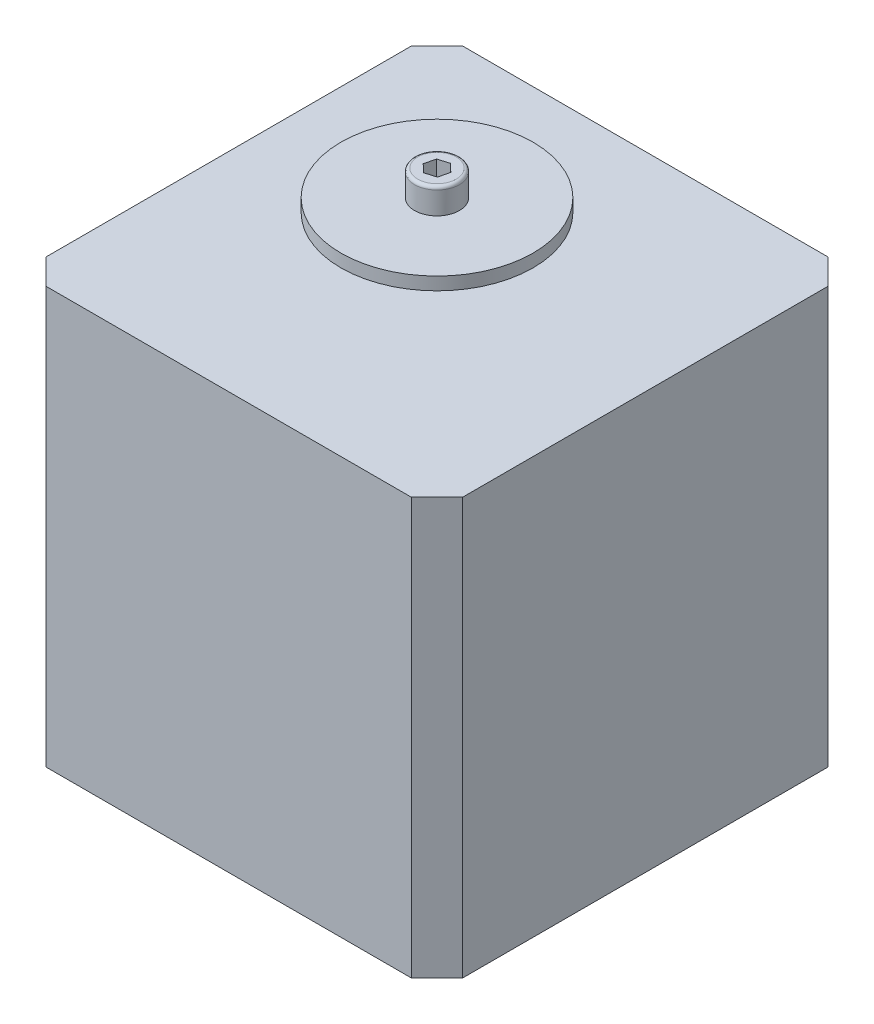
ISO-10303-21;
HEADER;
FILE_DESCRIPTION(('STEP AP214'),'2;1');
FILE_NAME('part.step','',(''),(''),'','','');
FILE_SCHEMA(('AUTOMOTIVE_DESIGN { 1 0 10303 214 1 1 1 1 }'));
ENDSEC;
DATA;
#1=APPLICATION_CONTEXT('core data for automotive mechanical design processes');
#2=APPLICATION_PROTOCOL_DEFINITION('international standard','automotive_design',2000,#1);
#3=PRODUCT_CONTEXT('',#1,'mechanical');
#4=PRODUCT('Part','Part','',(#3));
#5=PRODUCT_RELATED_PRODUCT_CATEGORY('part','',(#4));
#6=PRODUCT_DEFINITION_FORMATION('','',#4);
#7=PRODUCT_DEFINITION_CONTEXT('part definition',#1,'design');
#8=PRODUCT_DEFINITION('design','',#6,#7);
#9=PRODUCT_DEFINITION_SHAPE('','',#8);
#10=(LENGTH_UNIT() NAMED_UNIT(*) SI_UNIT(.MILLI.,.METRE.));
#11=(NAMED_UNIT(*) PLANE_ANGLE_UNIT() SI_UNIT($,.RADIAN.));
#12=(NAMED_UNIT(*) SI_UNIT($,.STERADIAN.) SOLID_ANGLE_UNIT());
#13=UNCERTAINTY_MEASURE_WITH_UNIT(LENGTH_MEASURE(1.E-05),#10,'distance_accuracy_value','');
#14=(GEOMETRIC_REPRESENTATION_CONTEXT(3) GLOBAL_UNCERTAINTY_ASSIGNED_CONTEXT((#13)) GLOBAL_UNIT_ASSIGNED_CONTEXT((#10,
#11,#12)) REPRESENTATION_CONTEXT('',''));
#15=CARTESIAN_POINT('',(0.,0.,0.));
#16=DIRECTION('',(0.,0.,1.));
#17=DIRECTION('',(1.,0.,0.));
#18=AXIS2_PLACEMENT_3D('',#15,#16,#17);
#19=CARTESIAN_POINT('',(3.,65.,0.));
#20=DIRECTION('',(0.,-1.,0.));
#21=DIRECTION('',(0.,0.,-1.));
#22=AXIS2_PLACEMENT_3D('',#19,#20,#21);
#23=PLANE('',#22);
#24=CARTESIAN_POINT('',(0.,65.,0.));
#25=DIRECTION('',(0.,-1.,0.));
#26=DIRECTION('',(0.,0.,-1.));
#27=AXIS2_PLACEMENT_3D('',#24,#25,#26);
#28=CIRCLE('',#27,3.);
#29=CARTESIAN_POINT('',(0.,65.,-3.));
#30=VERTEX_POINT('',#29);
#31=EDGE_CURVE('E147',#30,#30,#28,.T.);
#32=ORIENTED_EDGE('',*,*,#31,.T.);
#33=EDGE_LOOP('',(#32));
#34=FACE_BOUND('',#33,.T.);
#35=ADVANCED_FACE('F45',(#34),#23,.T.);
#36=CARTESIAN_POINT('',(3.5,79.,0.));
#37=DIRECTION('',(0.,1.,0.));
#38=DIRECTION('',(0.,0.,1.));
#39=AXIS2_PLACEMENT_3D('',#36,#37,#38);
#40=PLANE('',#39);
#41=CARTESIAN_POINT('',(0.,79.,0.));
#42=DIRECTION('',(0.,1.,0.));
#43=DIRECTION('',(0.,0.,1.));
#44=AXIS2_PLACEMENT_3D('',#41,#42,#43);
#45=CIRCLE('',#44,3.);
#46=CARTESIAN_POINT('',(0.,79.,3.));
#47=VERTEX_POINT('',#46);
#48=EDGE_CURVE('E12',#47,#47,#45,.T.);
#49=ORIENTED_EDGE('',*,*,#48,.T.);
#50=EDGE_LOOP('',(#49));
#51=FACE_BOUND('',#50,.T.);
#52=DIRECTION('',(0.957463301350185,0.,-0.288555066785534));
#53=VECTOR('',#52,1.);
#54=CARTESIAN_POINT('',(-0.396354941982275,79.,1.68609097025227));
#55=LINE('',#54,#53);
#56=CARTESIAN_POINT('',(-0.396354941982275,79.,1.68609097025227));
#57=VERTEX_POINT('',#56);
#58=CARTESIAN_POINT('',(1.26202014233888,79.,1.18629893379829));
#59=VERTEX_POINT('',#58);
#60=EDGE_CURVE('E60',#57,#59,#55,.T.);
#61=ORIENTED_EDGE('',*,*,#60,.F.);
#62=DIRECTION('',(0.72862766890208,0.,0.684910008767809));
#63=VECTOR('',#62,1.);
#64=CARTESIAN_POINT('',(-1.65837508432115,79.,0.499792036453975));
#65=LINE('',#64,#63);
#66=CARTESIAN_POINT('',(-1.65837508432115,79.,0.499792036453975));
#67=VERTEX_POINT('',#66);
#68=EDGE_CURVE('E143',#67,#57,#65,.T.);
#69=ORIENTED_EDGE('',*,*,#68,.F.);
#70=DIRECTION('',(-0.228835632448105,0.,0.973465075553343));
#71=VECTOR('',#70,1.);
#72=CARTESIAN_POINT('',(-1.26202014233888,79.,-1.18629893379829));
#73=LINE('',#72,#71);
#74=CARTESIAN_POINT('',(-1.26202014233888,79.,-1.18629893379829));
#75=VERTEX_POINT('',#74);
#76=EDGE_CURVE('E141',#75,#67,#73,.T.);
#77=ORIENTED_EDGE('',*,*,#76,.F.);
#78=DIRECTION('',(-0.957463301350186,0.,0.288555066785534));
#79=VECTOR('',#78,1.);
#80=CARTESIAN_POINT('',(0.396354941982275,79.,-1.68609097025227));
#81=LINE('',#80,#79);
#82=CARTESIAN_POINT('',(0.396354941982275,79.,-1.68609097025227));
#83=VERTEX_POINT('',#82);
#84=EDGE_CURVE('E108',#83,#75,#81,.T.);
#85=ORIENTED_EDGE('',*,*,#84,.F.);
#86=DIRECTION('',(-0.72862766890208,0.,-0.684910008767809));
#87=VECTOR('',#86,1.);
#88=CARTESIAN_POINT('',(1.65837508432115,79.,-0.499792036453975));
#89=LINE('',#88,#87);
#90=CARTESIAN_POINT('',(1.65837508432115,79.,-0.499792036453975));
#91=VERTEX_POINT('',#90);
#92=EDGE_CURVE('E137',#91,#83,#89,.T.);
#93=ORIENTED_EDGE('',*,*,#92,.F.);
#94=DIRECTION('',(0.228835632448105,0.,-0.973465075553343));
#95=VECTOR('',#94,1.);
#96=CARTESIAN_POINT('',(1.26202014233888,79.,1.18629893379829));
#97=LINE('',#96,#95);
#98=EDGE_CURVE('E134',#59,#91,#97,.T.);
#99=ORIENTED_EDGE('',*,*,#98,.F.);
#100=EDGE_LOOP('',(#61,#69,#77,#85,#93,#99));
#101=FACE_BOUND('',#100,.T.);
#102=ADVANCED_FACE('F181',(#51,#101),#40,.T.);
#103=CARTESIAN_POINT('',(0.,79.,0.));
#104=DIRECTION('',(0.,-1.,0.));
#105=DIRECTION('',(0.,0.,-1.));
#106=AXIS2_PLACEMENT_3D('',#103,#104,#105);
#107=CYLINDRICAL_SURFACE('',#106,3.5);
#108=CARTESIAN_POINT('',(0.,78.5,0.));
#109=DIRECTION('',(0.,1.,0.));
#110=DIRECTION('',(0.,0.,1.));
#111=AXIS2_PLACEMENT_3D('',#108,#109,#110);
#112=CIRCLE('',#111,3.5);
#113=CARTESIAN_POINT('',(0.,78.5,3.5));
#114=VERTEX_POINT('',#113);
#115=EDGE_CURVE('E53',#114,#114,#112,.F.);
#116=ORIENTED_EDGE('',*,*,#115,.T.);
#117=EDGE_LOOP('',(#116));
#118=FACE_BOUND('',#117,.T.);
#119=CARTESIAN_POINT('',(0.,75.,0.));
#120=DIRECTION('',(0.,-1.,0.));
#121=DIRECTION('',(0.,0.,-1.));
#122=AXIS2_PLACEMENT_3D('',#119,#120,#121);
#123=CIRCLE('',#122,3.5);
#124=CARTESIAN_POINT('',(0.,75.,-3.5));
#125=VERTEX_POINT('',#124);
#126=EDGE_CURVE('E164',#125,#125,#123,.T.);
#127=ORIENTED_EDGE('',*,*,#126,.F.);
#128=EDGE_LOOP('',(#127));
#129=FACE_BOUND('',#128,.T.);
#130=ADVANCED_FACE('F169',(#118,#129),#107,.T.);
#131=CARTESIAN_POINT('',(3.5,75.,0.));
#132=DIRECTION('',(0.,1.,0.));
#133=DIRECTION('',(0.,0.,1.));
#134=AXIS2_PLACEMENT_3D('',#131,#132,#133);
#135=PLANE('',#134);
#136=ORIENTED_EDGE('',*,*,#126,.T.);
#137=EDGE_LOOP('',(#136));
#138=FACE_BOUND('',#137,.T.);
#139=CARTESIAN_POINT('',(0.,75.,0.));
#140=DIRECTION('',(0.,-1.,0.));
#141=DIRECTION('',(0.,0.,-1.));
#142=AXIS2_PLACEMENT_3D('',#139,#140,#141);
#143=CIRCLE('',#142,15.);
#144=CARTESIAN_POINT('',(0.,75.,-15.));
#145=VERTEX_POINT('',#144);
#146=EDGE_CURVE('E161',#145,#145,#143,.T.);
#147=ORIENTED_EDGE('',*,*,#146,.F.);
#148=EDGE_LOOP('',(#147));
#149=FACE_BOUND('',#148,.T.);
#150=ADVANCED_FACE('F191',(#138,#149),#135,.T.);
#151=CARTESIAN_POINT('',(0.,79.,0.));
#152=DIRECTION('',(0.,-1.,0.));
#153=DIRECTION('',(0.,0.,-1.));
#154=AXIS2_PLACEMENT_3D('',#151,#152,#153);
#155=CYLINDRICAL_SURFACE('',#154,15.);
#156=ORIENTED_EDGE('',*,*,#146,.T.);
#157=EDGE_LOOP('',(#156));
#158=FACE_BOUND('',#157,.T.);
#159=CARTESIAN_POINT('',(0.,73.,0.));
#160=DIRECTION('',(0.,-1.,0.));
#161=DIRECTION('',(0.,0.,-1.));
#162=AXIS2_PLACEMENT_3D('',#159,#160,#161);
#163=CIRCLE('',#162,15.);
#164=CARTESIAN_POINT('',(0.,73.,-15.));
#165=VERTEX_POINT('',#164);
#166=EDGE_CURVE('E158',#165,#165,#163,.T.);
#167=ORIENTED_EDGE('',*,*,#166,.F.);
#168=EDGE_LOOP('',(#167));
#169=FACE_BOUND('',#168,.T.);
#170=ADVANCED_FACE('F194',(#158,#169),#155,.T.);
#171=CARTESIAN_POINT('',(15.,73.,0.));
#172=DIRECTION('',(0.,-1.,0.));
#173=DIRECTION('',(0.,0.,-1.));
#174=AXIS2_PLACEMENT_3D('',#171,#172,#173);
#175=PLANE('',#174);
#176=ORIENTED_EDGE('',*,*,#166,.T.);
#177=EDGE_LOOP('',(#176));
#178=FACE_BOUND('',#177,.T.);
#179=CARTESIAN_POINT('',(0.,73.,0.));
#180=DIRECTION('',(0.,-1.,0.));
#181=DIRECTION('',(0.,0.,-1.));
#182=AXIS2_PLACEMENT_3D('',#179,#180,#181);
#183=CIRCLE('',#182,3.);
#184=CARTESIAN_POINT('',(0.,73.,-3.));
#185=VERTEX_POINT('',#184);
#186=EDGE_CURVE('E155',#185,#185,#183,.T.);
#187=ORIENTED_EDGE('',*,*,#186,.F.);
#188=EDGE_LOOP('',(#187));
#189=FACE_BOUND('',#188,.T.);
#190=ADVANCED_FACE('F198',(#178,#189),#175,.T.);
#191=CARTESIAN_POINT('',(0.,79.,0.));
#192=DIRECTION('',(0.,-1.,0.));
#193=DIRECTION('',(0.,0.,-1.));
#194=AXIS2_PLACEMENT_3D('',#191,#192,#193);
#195=CYLINDRICAL_SURFACE('',#194,3.);
#196=ORIENTED_EDGE('',*,*,#186,.T.);
#197=EDGE_LOOP('',(#196));
#198=FACE_BOUND('',#197,.T.);
#199=ORIENTED_EDGE('',*,*,#31,.F.);
#200=EDGE_LOOP('',(#199));
#201=FACE_BOUND('',#200,.T.);
#202=ADVANCED_FACE('F202',(#198,#201),#195,.T.);
#203=CARTESIAN_POINT('',(-0.396354941982275,76.5,1.68609097025227));
#204=DIRECTION('',(0.288555066785534,0.,0.957463301350186));
#205=DIRECTION('',(0.957463301350186,0.,-0.288555066785534));
#206=AXIS2_PLACEMENT_3D('',#203,#204,#205);
#207=PLANE('',#206);
#208=ORIENTED_EDGE('',*,*,#60,.T.);
#209=DIRECTION('',(0.,1.,0.));
#210=VECTOR('',#209,1.);
#211=CARTESIAN_POINT('',(1.26202014233888,76.5,1.18629893379829));
#212=LINE('',#211,#210);
#213=CARTESIAN_POINT('',(1.26202014233888,76.5,1.18629893379829));
#214=VERTEX_POINT('',#213);
#215=EDGE_CURVE('E90',#214,#59,#212,.T.);
#216=ORIENTED_EDGE('',*,*,#215,.F.);
#217=DIRECTION('',(0.957463301350185,0.,-0.288555066785534));
#218=VECTOR('',#217,1.);
#219=CARTESIAN_POINT('',(-0.396354941982275,76.5,1.68609097025227));
#220=LINE('',#219,#218);
#221=CARTESIAN_POINT('',(-0.396354941982275,76.5,1.68609097025227));
#222=VERTEX_POINT('',#221);
#223=EDGE_CURVE('E145',#222,#214,#220,.T.);
#224=ORIENTED_EDGE('',*,*,#223,.F.);
#225=DIRECTION('',(0.,1.,0.));
#226=VECTOR('',#225,1.);
#227=CARTESIAN_POINT('',(-0.396354941982275,76.5,1.68609097025227));
#228=LINE('',#227,#226);
#229=EDGE_CURVE('E68',#222,#57,#228,.T.);
#230=ORIENTED_EDGE('',*,*,#229,.T.);
#231=EDGE_LOOP('',(#208,#216,#224,#230));
#232=FACE_BOUND('',#231,.T.);
#233=ADVANCED_FACE('F206',(#232),#207,.F.);
#234=CARTESIAN_POINT('',(-1.65837508432115,76.5,0.499792036453975));
#235=DIRECTION('',(-0.684910008767809,0.,0.72862766890208));
#236=DIRECTION('',(0.72862766890208,0.,0.684910008767809));
#237=AXIS2_PLACEMENT_3D('',#234,#235,#236);
#238=PLANE('',#237);
#239=ORIENTED_EDGE('',*,*,#68,.T.);
#240=ORIENTED_EDGE('',*,*,#229,.F.);
#241=DIRECTION('',(0.72862766890208,0.,0.684910008767809));
#242=VECTOR('',#241,1.);
#243=CARTESIAN_POINT('',(-1.65837508432115,76.5,0.499792036453975));
#244=LINE('',#243,#242);
#245=CARTESIAN_POINT('',(-1.65837508432115,76.5,0.499792036453975));
#246=VERTEX_POINT('',#245);
#247=EDGE_CURVE('E120',#246,#222,#244,.T.);
#248=ORIENTED_EDGE('',*,*,#247,.F.);
#249=DIRECTION('',(0.,1.,0.));
#250=VECTOR('',#249,1.);
#251=CARTESIAN_POINT('',(-1.65837508432115,76.5,0.499792036453975));
#252=LINE('',#251,#250);
#253=EDGE_CURVE('E112',#246,#67,#252,.T.);
#254=ORIENTED_EDGE('',*,*,#253,.T.);
#255=EDGE_LOOP('',(#239,#240,#248,#254));
#256=FACE_BOUND('',#255,.T.);
#257=ADVANCED_FACE('F210',(#256),#238,.F.);
#258=CARTESIAN_POINT('',(-1.26202014233888,76.5,-1.18629893379829));
#259=DIRECTION('',(-0.973465075553343,0.,-0.228835632448105));
#260=DIRECTION('',(-0.228835632448105,0.,0.973465075553343));
#261=AXIS2_PLACEMENT_3D('',#258,#259,#260);
#262=PLANE('',#261);
#263=ORIENTED_EDGE('',*,*,#76,.T.);
#264=ORIENTED_EDGE('',*,*,#253,.F.);
#265=DIRECTION('',(-0.228835632448105,0.,0.973465075553343));
#266=VECTOR('',#265,1.);
#267=CARTESIAN_POINT('',(-1.26202014233888,76.5,-1.18629893379829));
#268=LINE('',#267,#266);
#269=CARTESIAN_POINT('',(-1.26202014233888,76.5,-1.18629893379829));
#270=VERTEX_POINT('',#269);
#271=EDGE_CURVE('E116',#270,#246,#268,.T.);
#272=ORIENTED_EDGE('',*,*,#271,.F.);
#273=DIRECTION('',(0.,1.,0.));
#274=VECTOR('',#273,1.);
#275=CARTESIAN_POINT('',(-1.26202014233888,76.5,-1.18629893379829));
#276=LINE('',#275,#274);
#277=EDGE_CURVE('E101',#270,#75,#276,.T.);
#278=ORIENTED_EDGE('',*,*,#277,.T.);
#279=EDGE_LOOP('',(#263,#264,#272,#278));
#280=FACE_BOUND('',#279,.T.);
#281=ADVANCED_FACE('F117',(#280),#262,.F.);
#282=CARTESIAN_POINT('',(0.396354941982275,76.5,-1.68609097025227));
#283=DIRECTION('',(-0.288555066785534,0.,-0.957463301350186));
#284=DIRECTION('',(-0.957463301350186,0.,0.288555066785534));
#285=AXIS2_PLACEMENT_3D('',#282,#283,#284);
#286=PLANE('',#285);
#287=ORIENTED_EDGE('',*,*,#84,.T.);
#288=ORIENTED_EDGE('',*,*,#277,.F.);
#289=DIRECTION('',(-0.957463301350186,0.,0.288555066785534));
#290=VECTOR('',#289,1.);
#291=CARTESIAN_POINT('',(0.396354941982275,76.5,-1.68609097025227));
#292=LINE('',#291,#290);
#293=CARTESIAN_POINT('',(0.396354941982275,76.5,-1.68609097025227));
#294=VERTEX_POINT('',#293);
#295=EDGE_CURVE('E105',#294,#270,#292,.T.);
#296=ORIENTED_EDGE('',*,*,#295,.F.);
#297=DIRECTION('',(0.,1.,0.));
#298=VECTOR('',#297,1.);
#299=CARTESIAN_POINT('',(0.396354941982275,76.5,-1.68609097025227));
#300=LINE('',#299,#298);
#301=EDGE_CURVE('E113',#294,#83,#300,.T.);
#302=ORIENTED_EDGE('',*,*,#301,.T.);
#303=EDGE_LOOP('',(#287,#288,#296,#302));
#304=FACE_BOUND('',#303,.T.);
#305=ADVANCED_FACE('F103',(#304),#286,.F.);
#306=CARTESIAN_POINT('',(1.65837508432115,76.5,-0.499792036453975));
#307=DIRECTION('',(0.684910008767809,0.,-0.72862766890208));
#308=DIRECTION('',(-0.72862766890208,0.,-0.684910008767809));
#309=AXIS2_PLACEMENT_3D('',#306,#307,#308);
#310=PLANE('',#309);
#311=ORIENTED_EDGE('',*,*,#92,.T.);
#312=ORIENTED_EDGE('',*,*,#301,.F.);
#313=DIRECTION('',(-0.72862766890208,0.,-0.684910008767809));
#314=VECTOR('',#313,1.);
#315=CARTESIAN_POINT('',(1.65837508432115,76.5,-0.499792036453975));
#316=LINE('',#315,#314);
#317=CARTESIAN_POINT('',(1.65837508432115,76.5,-0.499792036453975));
#318=VERTEX_POINT('',#317);
#319=EDGE_CURVE('E126',#318,#294,#316,.T.);
#320=ORIENTED_EDGE('',*,*,#319,.F.);
#321=DIRECTION('',(0.,1.,0.));
#322=VECTOR('',#321,1.);
#323=CARTESIAN_POINT('',(1.65837508432115,76.5,-0.499792036453975));
#324=LINE('',#323,#322);
#325=EDGE_CURVE('E150',#318,#91,#324,.T.);
#326=ORIENTED_EDGE('',*,*,#325,.T.);
#327=EDGE_LOOP('',(#311,#312,#320,#326));
#328=FACE_BOUND('',#327,.T.);
#329=ADVANCED_FACE('F213',(#328),#310,.F.);
#330=CARTESIAN_POINT('',(1.26202014233888,76.5,1.18629893379829));
#331=DIRECTION('',(0.973465075553343,0.,0.228835632448105));
#332=DIRECTION('',(0.228835632448105,0.,-0.973465075553343));
#333=AXIS2_PLACEMENT_3D('',#330,#331,#332);
#334=PLANE('',#333);
#335=ORIENTED_EDGE('',*,*,#98,.T.);
#336=ORIENTED_EDGE('',*,*,#325,.F.);
#337=DIRECTION('',(0.228835632448105,0.,-0.973465075553343));
#338=VECTOR('',#337,1.);
#339=CARTESIAN_POINT('',(1.26202014233888,76.5,1.18629893379829));
#340=LINE('',#339,#338);
#341=EDGE_CURVE('E128',#214,#318,#340,.T.);
#342=ORIENTED_EDGE('',*,*,#341,.F.);
#343=ORIENTED_EDGE('',*,*,#215,.T.);
#344=EDGE_LOOP('',(#335,#336,#342,#343));
#345=FACE_BOUND('',#344,.T.);
#346=ADVANCED_FACE('F177',(#345),#334,.F.);
#347=CARTESIAN_POINT('',(0.,76.5,0.));
#348=DIRECTION('',(0.,1.,0.));
#349=DIRECTION('',(0.,0.,1.));
#350=AXIS2_PLACEMENT_3D('',#347,#348,#349);
#351=PLANE('',#350);
#352=ORIENTED_EDGE('',*,*,#223,.T.);
#353=ORIENTED_EDGE('',*,*,#341,.T.);
#354=ORIENTED_EDGE('',*,*,#319,.T.);
#355=ORIENTED_EDGE('',*,*,#295,.T.);
#356=ORIENTED_EDGE('',*,*,#271,.T.);
#357=ORIENTED_EDGE('',*,*,#247,.T.);
#358=EDGE_LOOP('',(#352,#353,#354,#355,#356,#357));
#359=FACE_BOUND('',#358,.T.);
#360=ADVANCED_FACE('F123',(#359),#351,.T.);
#361=CARTESIAN_POINT('',(0.,78.5,0.));
#362=DIRECTION('',(0.,1.,0.));
#363=DIRECTION('',(0.,0.,1.));
#364=AXIS2_PLACEMENT_3D('',#361,#362,#363);
#365=TOROIDAL_SURFACE('',#364,3.,0.5);
#366=ORIENTED_EDGE('',*,*,#48,.F.);
#367=EDGE_LOOP('',(#366));
#368=FACE_BOUND('',#367,.T.);
#369=ORIENTED_EDGE('',*,*,#115,.F.);
#370=EDGE_LOOP('',(#369));
#371=FACE_BOUND('',#370,.T.);
#372=ADVANCED_FACE('F47',(#368,#371),#365,.T.);
#373=CLOSED_SHELL('',(#35,#102,#130,#150,#170,#190,#202,#233,#257,#281,#305,#329,#346,#360,#372));
#374=MANIFOLD_SOLID_BREP('B2',#373);
#375=CARTESIAN_POINT('',(32.5,65.,32.5));
#376=DIRECTION('',(-1.,0.,0.));
#377=DIRECTION('',(0.,0.,1.));
#378=AXIS2_PLACEMENT_3D('',#375,#376,#377);
#379=PLANE('',#378);
#380=DIRECTION('',(0.,0.,-1.));
#381=VECTOR('',#380,1.);
#382=CARTESIAN_POINT('',(32.5,65.,32.5));
#383=LINE('',#382,#381);
#384=CARTESIAN_POINT('',(32.5,65.,28.5));
#385=VERTEX_POINT('',#384);
#386=CARTESIAN_POINT('',(32.5,65.,-28.5));
#387=VERTEX_POINT('',#386);
#388=EDGE_CURVE('E412',#385,#387,#383,.T.);
#389=ORIENTED_EDGE('',*,*,#388,.F.);
#390=DIRECTION('',(0.,-1.,0.));
#391=VECTOR('',#390,1.);
#392=CARTESIAN_POINT('',(32.5,65.,28.5));
#393=LINE('',#392,#391);
#394=CARTESIAN_POINT('',(32.5,0.,28.5));
#395=VERTEX_POINT('',#394);
#396=EDGE_CURVE('E397',#385,#395,#393,.T.);
#397=ORIENTED_EDGE('',*,*,#396,.T.);
#398=DIRECTION('',(0.,0.,-1.));
#399=VECTOR('',#398,1.);
#400=CARTESIAN_POINT('',(32.5,0.,32.5));
#401=LINE('',#400,#399);
#402=CARTESIAN_POINT('',(32.5,0.,-28.5));
#403=VERTEX_POINT('',#402);
#404=EDGE_CURVE('E409',#395,#403,#401,.T.);
#405=ORIENTED_EDGE('',*,*,#404,.T.);
#406=DIRECTION('',(0.,1.,0.));
#407=VECTOR('',#406,1.);
#408=CARTESIAN_POINT('',(32.5,65.,-28.5));
#409=LINE('',#408,#407);
#410=EDGE_CURVE('E414',#403,#387,#409,.T.);
#411=ORIENTED_EDGE('',*,*,#410,.T.);
#412=EDGE_LOOP('',(#389,#397,#405,#411));
#413=FACE_BOUND('',#412,.T.);
#414=ADVANCED_FACE('F326',(#413),#379,.F.);
#415=CARTESIAN_POINT('',(-32.5,65.,-32.5));
#416=DIRECTION('',(0.,0.,1.));
#417=DIRECTION('',(1.,0.,0.));
#418=AXIS2_PLACEMENT_3D('',#415,#416,#417);
#419=PLANE('',#418);
#420=DIRECTION('',(-1.,0.,0.));
#421=VECTOR('',#420,1.);
#422=CARTESIAN_POINT('',(-32.5,65.,-32.5));
#423=LINE('',#422,#421);
#424=CARTESIAN_POINT('',(28.5,65.,-32.5));
#425=VERTEX_POINT('',#424);
#426=CARTESIAN_POINT('',(-28.5,65.,-32.5));
#427=VERTEX_POINT('',#426);
#428=EDGE_CURVE('E452',#425,#427,#423,.T.);
#429=ORIENTED_EDGE('',*,*,#428,.F.);
#430=DIRECTION('',(0.,-1.,0.));
#431=VECTOR('',#430,1.);
#432=CARTESIAN_POINT('',(28.5,65.,-32.5));
#433=LINE('',#432,#431);
#434=CARTESIAN_POINT('',(28.5,0.,-32.5));
#435=VERTEX_POINT('',#434);
#436=EDGE_CURVE('E43',#425,#435,#433,.T.);
#437=ORIENTED_EDGE('',*,*,#436,.T.);
#438=DIRECTION('',(-1.,0.,0.));
#439=VECTOR('',#438,1.);
#440=CARTESIAN_POINT('',(-32.5,0.,-32.5));
#441=LINE('',#440,#439);
#442=CARTESIAN_POINT('',(-28.5,0.,-32.5));
#443=VERTEX_POINT('',#442);
#444=EDGE_CURVE('E419',#435,#443,#441,.T.);
#445=ORIENTED_EDGE('',*,*,#444,.T.);
#446=DIRECTION('',(0.,1.,0.));
#447=VECTOR('',#446,1.);
#448=CARTESIAN_POINT('',(-28.5,65.,-32.5));
#449=LINE('',#448,#447);
#450=EDGE_CURVE('E334',#443,#427,#449,.T.);
#451=ORIENTED_EDGE('',*,*,#450,.T.);
#452=EDGE_LOOP('',(#429,#437,#445,#451));
#453=FACE_BOUND('',#452,.T.);
#454=ADVANCED_FACE('F451',(#453),#419,.F.);
#455=CARTESIAN_POINT('',(-32.5,65.,32.5));
#456=DIRECTION('',(1.,0.,0.));
#457=DIRECTION('',(0.,0.,-1.));
#458=AXIS2_PLACEMENT_3D('',#455,#456,#457);
#459=PLANE('',#458);
#460=DIRECTION('',(0.,0.,1.));
#461=VECTOR('',#460,1.);
#462=CARTESIAN_POINT('',(-32.5,0.,32.5));
#463=LINE('',#462,#461);
#464=CARTESIAN_POINT('',(-32.5,0.,-28.5));
#465=VERTEX_POINT('',#464);
#466=CARTESIAN_POINT('',(-32.5,0.,28.5));
#467=VERTEX_POINT('',#466);
#468=EDGE_CURVE('E422',#465,#467,#463,.T.);
#469=ORIENTED_EDGE('',*,*,#468,.T.);
#470=DIRECTION('',(0.,1.,0.));
#471=VECTOR('',#470,1.);
#472=CARTESIAN_POINT('',(-32.5,65.,28.5));
#473=LINE('',#472,#471);
#474=CARTESIAN_POINT('',(-32.5,65.,28.5));
#475=VERTEX_POINT('',#474);
#476=EDGE_CURVE('E341',#467,#475,#473,.T.);
#477=ORIENTED_EDGE('',*,*,#476,.T.);
#478=DIRECTION('',(0.,0.,1.));
#479=VECTOR('',#478,1.);
#480=CARTESIAN_POINT('',(-32.5,65.,32.5));
#481=LINE('',#480,#479);
#482=CARTESIAN_POINT('',(-32.5,65.,-28.5));
#483=VERTEX_POINT('',#482);
#484=EDGE_CURVE('E458',#483,#475,#481,.T.);
#485=ORIENTED_EDGE('',*,*,#484,.F.);
#486=DIRECTION('',(0.,-1.,0.));
#487=VECTOR('',#486,1.);
#488=CARTESIAN_POINT('',(-32.5,65.,-28.5));
#489=LINE('',#488,#487);
#490=EDGE_CURVE('E445',#483,#465,#489,.T.);
#491=ORIENTED_EDGE('',*,*,#490,.T.);
#492=EDGE_LOOP('',(#469,#477,#485,#491));
#493=FACE_BOUND('',#492,.T.);
#494=ADVANCED_FACE('F462',(#493),#459,.F.);
#495=CARTESIAN_POINT('',(-32.5,65.,32.5));
#496=DIRECTION('',(0.,0.,-1.));
#497=DIRECTION('',(-1.,0.,0.));
#498=AXIS2_PLACEMENT_3D('',#495,#496,#497);
#499=PLANE('',#498);
#500=DIRECTION('',(1.,0.,0.));
#501=VECTOR('',#500,1.);
#502=CARTESIAN_POINT('',(-32.5,0.,32.5));
#503=LINE('',#502,#501);
#504=CARTESIAN_POINT('',(-28.5,0.,32.5));
#505=VERTEX_POINT('',#504);
#506=CARTESIAN_POINT('',(28.5,0.,32.5));
#507=VERTEX_POINT('',#506);
#508=EDGE_CURVE('E429',#505,#507,#503,.T.);
#509=ORIENTED_EDGE('',*,*,#508,.T.);
#510=DIRECTION('',(0.,1.,0.));
#511=VECTOR('',#510,1.);
#512=CARTESIAN_POINT('',(28.5,65.,32.5));
#513=LINE('',#512,#511);
#514=CARTESIAN_POINT('',(28.5,65.,32.5));
#515=VERTEX_POINT('',#514);
#516=EDGE_CURVE('E398',#507,#515,#513,.T.);
#517=ORIENTED_EDGE('',*,*,#516,.T.);
#518=DIRECTION('',(1.,0.,0.));
#519=VECTOR('',#518,1.);
#520=CARTESIAN_POINT('',(-32.5,65.,32.5));
#521=LINE('',#520,#519);
#522=CARTESIAN_POINT('',(-28.5,65.,32.5));
#523=VERTEX_POINT('',#522);
#524=EDGE_CURVE('E425',#523,#515,#521,.T.);
#525=ORIENTED_EDGE('',*,*,#524,.F.);
#526=DIRECTION('',(0.,-1.,0.));
#527=VECTOR('',#526,1.);
#528=CARTESIAN_POINT('',(-28.5,65.,32.5));
#529=LINE('',#528,#527);
#530=EDGE_CURVE('E403',#523,#505,#529,.T.);
#531=ORIENTED_EDGE('',*,*,#530,.T.);
#532=EDGE_LOOP('',(#509,#517,#525,#531));
#533=FACE_BOUND('',#532,.T.);
#534=ADVANCED_FACE('F469',(#533),#499,.F.);
#535=CARTESIAN_POINT('',(0.,65.,0.));
#536=DIRECTION('',(0.,-1.,0.));
#537=DIRECTION('',(0.,0.,-1.));
#538=AXIS2_PLACEMENT_3D('',#535,#536,#537);
#539=PLANE('',#538);
#540=ORIENTED_EDGE('',*,*,#524,.T.);
#541=DIRECTION('',(-0.707106781186549,0.,0.707106781186546));
#542=VECTOR('',#541,1.);
#543=CARTESIAN_POINT('',(32.5,65.,28.5));
#544=LINE('',#543,#542);
#545=EDGE_CURVE('E443',#515,#385,#544,.F.);
#546=ORIENTED_EDGE('',*,*,#545,.T.);
#547=ORIENTED_EDGE('',*,*,#388,.T.);
#548=DIRECTION('',(0.707106781186546,0.,0.707106781186549));
#549=VECTOR('',#548,1.);
#550=CARTESIAN_POINT('',(28.5,65.,-32.5));
#551=LINE('',#550,#549);
#552=EDGE_CURVE('E439',#387,#425,#551,.F.);
#553=ORIENTED_EDGE('',*,*,#552,.T.);
#554=ORIENTED_EDGE('',*,*,#428,.T.);
#555=DIRECTION('',(0.707106781186549,0.,-0.707106781186546));
#556=VECTOR('',#555,1.);
#557=CARTESIAN_POINT('',(-32.5,65.,-28.5));
#558=LINE('',#557,#556);
#559=EDGE_CURVE('E348',#427,#483,#558,.F.);
#560=ORIENTED_EDGE('',*,*,#559,.T.);
#561=ORIENTED_EDGE('',*,*,#484,.T.);
#562=DIRECTION('',(-0.707106781186546,0.,-0.707106781186549));
#563=VECTOR('',#562,1.);
#564=CARTESIAN_POINT('',(-28.5,65.,32.5));
#565=LINE('',#564,#563);
#566=EDGE_CURVE('E441',#475,#523,#565,.F.);
#567=ORIENTED_EDGE('',*,*,#566,.T.);
#568=EDGE_LOOP('',(#540,#546,#547,#553,#554,#560,#561,#567));
#569=FACE_BOUND('',#568,.T.);
#570=ADVANCED_FACE('F456',(#569),#539,.F.);
#571=CARTESIAN_POINT('',(0.,0.,0.));
#572=DIRECTION('',(0.,-1.,0.));
#573=DIRECTION('',(0.,0.,-1.));
#574=AXIS2_PLACEMENT_3D('',#571,#572,#573);
#575=PLANE('',#574);
#576=ORIENTED_EDGE('',*,*,#404,.F.);
#577=DIRECTION('',(0.707106781186549,0.,-0.707106781186546));
#578=VECTOR('',#577,1.);
#579=CARTESIAN_POINT('',(30.4999999999999,0.,30.5000000000001));
#580=LINE('',#579,#578);
#581=EDGE_CURVE('E393',#395,#507,#580,.F.);
#582=ORIENTED_EDGE('',*,*,#581,.T.);
#583=ORIENTED_EDGE('',*,*,#508,.F.);
#584=DIRECTION('',(0.707106781186546,0.,0.707106781186549));
#585=VECTOR('',#584,1.);
#586=CARTESIAN_POINT('',(-30.5,0.,30.4999999999999));
#587=LINE('',#586,#585);
#588=EDGE_CURVE('E404',#505,#467,#587,.F.);
#589=ORIENTED_EDGE('',*,*,#588,.T.);
#590=ORIENTED_EDGE('',*,*,#468,.F.);
#591=DIRECTION('',(-0.707106781186549,0.,0.707106781186546));
#592=VECTOR('',#591,1.);
#593=CARTESIAN_POINT('',(-30.4999999999999,0.,-30.5000000000001));
#594=LINE('',#593,#592);
#595=EDGE_CURVE('E413',#465,#443,#594,.F.);
#596=ORIENTED_EDGE('',*,*,#595,.T.);
#597=ORIENTED_EDGE('',*,*,#444,.F.);
#598=DIRECTION('',(-0.707106781186546,0.,-0.707106781186549));
#599=VECTOR('',#598,1.);
#600=CARTESIAN_POINT('',(30.5,0.,-30.4999999999999));
#601=LINE('',#600,#599);
#602=EDGE_CURVE('E418',#435,#403,#601,.F.);
#603=ORIENTED_EDGE('',*,*,#602,.T.);
#604=EDGE_LOOP('',(#576,#582,#583,#589,#590,#596,#597,#603));
#605=FACE_BOUND('',#604,.T.);
#606=ADVANCED_FACE('F416',(#605),#575,.T.);
#607=CARTESIAN_POINT('',(32.5,65.,28.5));
#608=DIRECTION('',(-0.707106781186546,0.,-0.707106781186549));
#609=DIRECTION('',(0.,-1.,0.));
#610=AXIS2_PLACEMENT_3D('',#607,#608,#609);
#611=PLANE('',#610);
#612=ORIENTED_EDGE('',*,*,#545,.F.);
#613=ORIENTED_EDGE('',*,*,#516,.F.);
#614=ORIENTED_EDGE('',*,*,#581,.F.);
#615=ORIENTED_EDGE('',*,*,#396,.F.);
#616=EDGE_LOOP('',(#612,#613,#614,#615));
#617=FACE_BOUND('',#616,.T.);
#618=ADVANCED_FACE('F396',(#617),#611,.F.);
#619=CARTESIAN_POINT('',(-28.5,65.,32.5));
#620=DIRECTION('',(0.707106781186549,0.,-0.707106781186546));
#621=DIRECTION('',(0.,-1.,0.));
#622=AXIS2_PLACEMENT_3D('',#619,#620,#621);
#623=PLANE('',#622);
#624=ORIENTED_EDGE('',*,*,#566,.F.);
#625=ORIENTED_EDGE('',*,*,#476,.F.);
#626=ORIENTED_EDGE('',*,*,#588,.F.);
#627=ORIENTED_EDGE('',*,*,#530,.F.);
#628=EDGE_LOOP('',(#624,#625,#626,#627));
#629=FACE_BOUND('',#628,.T.);
#630=ADVANCED_FACE('F466',(#629),#623,.F.);
#631=CARTESIAN_POINT('',(28.5,65.,-32.5));
#632=DIRECTION('',(-0.707106781186549,0.,0.707106781186546));
#633=DIRECTION('',(0.,-1.,0.));
#634=AXIS2_PLACEMENT_3D('',#631,#632,#633);
#635=PLANE('',#634);
#636=ORIENTED_EDGE('',*,*,#552,.F.);
#637=ORIENTED_EDGE('',*,*,#410,.F.);
#638=ORIENTED_EDGE('',*,*,#602,.F.);
#639=ORIENTED_EDGE('',*,*,#436,.F.);
#640=EDGE_LOOP('',(#636,#637,#638,#639));
#641=FACE_BOUND('',#640,.T.);
#642=ADVANCED_FACE('F472',(#641),#635,.F.);
#643=CARTESIAN_POINT('',(-32.5,65.,-28.5));
#644=DIRECTION('',(0.707106781186546,0.,0.707106781186549));
#645=DIRECTION('',(0.,-1.,0.));
#646=AXIS2_PLACEMENT_3D('',#643,#644,#645);
#647=PLANE('',#646);
#648=ORIENTED_EDGE('',*,*,#559,.F.);
#649=ORIENTED_EDGE('',*,*,#450,.F.);
#650=ORIENTED_EDGE('',*,*,#595,.F.);
#651=ORIENTED_EDGE('',*,*,#490,.F.);
#652=EDGE_LOOP('',(#648,#649,#650,#651));
#653=FACE_BOUND('',#652,.T.);
#654=ADVANCED_FACE('F328',(#653),#647,.F.);
#655=CLOSED_SHELL('',(#414,#454,#494,#534,#570,#606,#618,#630,#642,#654));
#656=MANIFOLD_SOLID_BREP('B6',#655);
#657=ADVANCED_BREP_SHAPE_REPRESENTATION('',(#18,#374,#656),#14);
#658=SHAPE_DEFINITION_REPRESENTATION(#9,#657);
ENDSEC;
END-ISO-10303-21;
